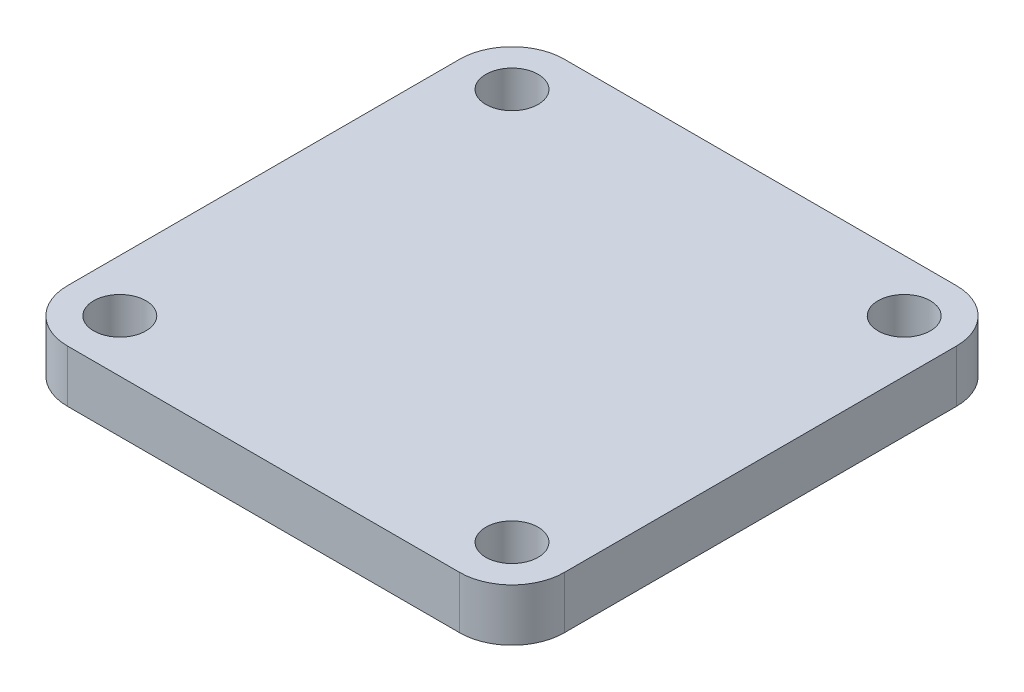
ISO-10303-21;
HEADER;
FILE_DESCRIPTION(('STEP AP214'),'2;1');
FILE_NAME('part.step','',(''),(''),'','','');
FILE_SCHEMA(('AUTOMOTIVE_DESIGN { 1 0 10303 214 1 1 1 1 }'));
ENDSEC;
DATA;
#1=APPLICATION_CONTEXT('core data for automotive mechanical design processes');
#2=APPLICATION_PROTOCOL_DEFINITION('international standard','automotive_design',2000,#1);
#3=PRODUCT_CONTEXT('',#1,'mechanical');
#4=PRODUCT('Part','Part','',(#3));
#5=PRODUCT_RELATED_PRODUCT_CATEGORY('part','',(#4));
#6=PRODUCT_DEFINITION_FORMATION('','',#4);
#7=PRODUCT_DEFINITION_CONTEXT('part definition',#1,'design');
#8=PRODUCT_DEFINITION('design','',#6,#7);
#9=PRODUCT_DEFINITION_SHAPE('','',#8);
#10=(LENGTH_UNIT() NAMED_UNIT(*) SI_UNIT(.MILLI.,.METRE.));
#11=(NAMED_UNIT(*) PLANE_ANGLE_UNIT() SI_UNIT($,.RADIAN.));
#12=(NAMED_UNIT(*) SI_UNIT($,.STERADIAN.) SOLID_ANGLE_UNIT());
#13=UNCERTAINTY_MEASURE_WITH_UNIT(LENGTH_MEASURE(1.E-05),#10,'distance_accuracy_value','');
#14=(GEOMETRIC_REPRESENTATION_CONTEXT(3) GLOBAL_UNCERTAINTY_ASSIGNED_CONTEXT((#13)) GLOBAL_UNIT_ASSIGNED_CONTEXT((#10,
#11,#12)) REPRESENTATION_CONTEXT('',''));
#15=CARTESIAN_POINT('',(0.,0.,0.));
#16=DIRECTION('',(0.,0.,1.));
#17=DIRECTION('',(1.,0.,0.));
#18=AXIS2_PLACEMENT_3D('',#15,#16,#17);
#19=CARTESIAN_POINT('',(8.58680344171121,2.,8.46010638297872));
#20=DIRECTION('',(0.,1.,0.));
#21=DIRECTION('',(0.,0.,1.));
#22=AXIS2_PLACEMENT_3D('',#19,#20,#21);
#23=PLANE('',#22);
#24=CARTESIAN_POINT('',(8.58680344171121,2.,8.46010638297872));
#25=DIRECTION('',(0.,1.,0.));
#26=DIRECTION('',(0.,0.,1.));
#27=AXIS2_PLACEMENT_3D('',#24,#25,#26);
#28=CIRCLE('',#27,1.);
#29=CARTESIAN_POINT('',(8.58680344171121,2.,9.46010638297872));
#30=VERTEX_POINT('',#29);
#31=EDGE_CURVE('E190',#30,#30,#28,.T.);
#32=ORIENTED_EDGE('',*,*,#31,.F.);
#33=EDGE_LOOP('',(#32));
#34=FACE_BOUND('',#33,.T.);
#35=CARTESIAN_POINT('',(-6.41319655828879,2.,-6.53989361702128));
#36=DIRECTION('',(0.,1.,0.));
#37=DIRECTION('',(0.,0.,1.));
#38=AXIS2_PLACEMENT_3D('',#35,#36,#37);
#39=CIRCLE('',#38,1.);
#40=CARTESIAN_POINT('',(-6.41319655828879,2.,-5.53989361702128));
#41=VERTEX_POINT('',#40);
#42=EDGE_CURVE('E136',#41,#41,#39,.T.);
#43=ORIENTED_EDGE('',*,*,#42,.F.);
#44=EDGE_LOOP('',(#43));
#45=FACE_BOUND('',#44,.T.);
#46=CARTESIAN_POINT('',(8.58680344171121,2.,8.46010638297872));
#47=DIRECTION('',(0.,1.,0.));
#48=DIRECTION('',(0.,0.,1.));
#49=AXIS2_PLACEMENT_3D('',#46,#47,#48);
#50=CIRCLE('',#49,2.);
#51=CARTESIAN_POINT('',(8.58680344171121,2.,10.4601063829787));
#52=VERTEX_POINT('',#51);
#53=CARTESIAN_POINT('',(10.5868034417112,2.,8.46010638297872));
#54=VERTEX_POINT('',#53);
#55=EDGE_CURVE('E147',#52,#54,#50,.T.);
#56=ORIENTED_EDGE('',*,*,#55,.T.);
#57=DIRECTION('',(0.,0.,-1.));
#58=VECTOR('',#57,1.);
#59=CARTESIAN_POINT('',(10.5868034417112,2.,-6.53989361702128));
#60=LINE('',#59,#58);
#61=CARTESIAN_POINT('',(10.5868034417112,2.,-6.53989361702128));
#62=VERTEX_POINT('',#61);
#63=EDGE_CURVE('E95',#54,#62,#60,.T.);
#64=ORIENTED_EDGE('',*,*,#63,.T.);
#65=CARTESIAN_POINT('',(8.58680344171121,2.,-6.53989361702128));
#66=DIRECTION('',(0.,1.,0.));
#67=DIRECTION('',(0.,0.,1.));
#68=AXIS2_PLACEMENT_3D('',#65,#66,#67);
#69=CIRCLE('',#68,2.);
#70=CARTESIAN_POINT('',(8.58680344171121,2.,-8.53989361702128));
#71=VERTEX_POINT('',#70);
#72=EDGE_CURVE('E162',#62,#71,#69,.T.);
#73=ORIENTED_EDGE('',*,*,#72,.T.);
#74=DIRECTION('',(-1.,0.,0.));
#75=VECTOR('',#74,1.);
#76=CARTESIAN_POINT('',(-6.41319655828879,2.,-8.53989361702128));
#77=LINE('',#76,#75);
#78=CARTESIAN_POINT('',(-6.41319655828879,2.,-8.53989361702128));
#79=VERTEX_POINT('',#78);
#80=EDGE_CURVE('E175',#71,#79,#77,.T.);
#81=ORIENTED_EDGE('',*,*,#80,.T.);
#82=CARTESIAN_POINT('',(-6.41319655828879,2.,-6.53989361702128));
#83=DIRECTION('',(0.,1.,0.));
#84=DIRECTION('',(0.,0.,1.));
#85=AXIS2_PLACEMENT_3D('',#82,#83,#84);
#86=CIRCLE('',#85,2.);
#87=CARTESIAN_POINT('',(-8.41319655828879,2.,-6.53989361702128));
#88=VERTEX_POINT('',#87);
#89=EDGE_CURVE('E114',#79,#88,#86,.T.);
#90=ORIENTED_EDGE('',*,*,#89,.T.);
#91=DIRECTION('',(0.,0.,1.));
#92=VECTOR('',#91,1.);
#93=CARTESIAN_POINT('',(-8.41319655828879,2.,-6.53989361702128));
#94=LINE('',#93,#92);
#95=CARTESIAN_POINT('',(-8.41319655828879,2.,8.46010638297872));
#96=VERTEX_POINT('',#95);
#97=EDGE_CURVE('E108',#88,#96,#94,.T.);
#98=ORIENTED_EDGE('',*,*,#97,.T.);
#99=CARTESIAN_POINT('',(-6.41319655828879,2.,8.46010638297872));
#100=DIRECTION('',(0.,1.,0.));
#101=DIRECTION('',(0.,0.,1.));
#102=AXIS2_PLACEMENT_3D('',#99,#100,#101);
#103=CIRCLE('',#102,2.);
#104=CARTESIAN_POINT('',(-6.41319655828879,2.,10.4601063829787));
#105=VERTEX_POINT('',#104);
#106=EDGE_CURVE('E112',#96,#105,#103,.T.);
#107=ORIENTED_EDGE('',*,*,#106,.T.);
#108=DIRECTION('',(1.,0.,0.));
#109=VECTOR('',#108,1.);
#110=CARTESIAN_POINT('',(-6.41319655828879,2.,10.4601063829787));
#111=LINE('',#110,#109);
#112=EDGE_CURVE('E52',#105,#52,#111,.T.);
#113=ORIENTED_EDGE('',*,*,#112,.T.);
#114=EDGE_LOOP('',(#56,#64,#73,#81,#90,#98,#107,#113));
#115=FACE_BOUND('',#114,.T.);
#116=CARTESIAN_POINT('',(8.58680344171121,2.,-6.53989361702128));
#117=DIRECTION('',(0.,1.,0.));
#118=DIRECTION('',(0.,0.,1.));
#119=AXIS2_PLACEMENT_3D('',#116,#117,#118);
#120=CIRCLE('',#119,1.);
#121=CARTESIAN_POINT('',(8.58680344171121,2.,-5.53989361702128));
#122=VERTEX_POINT('',#121);
#123=EDGE_CURVE('E184',#122,#122,#120,.T.);
#124=ORIENTED_EDGE('',*,*,#123,.F.);
#125=EDGE_LOOP('',(#124));
#126=FACE_BOUND('',#125,.T.);
#127=CARTESIAN_POINT('',(-6.41319655828879,2.,8.46010638297872));
#128=DIRECTION('',(0.,1.,0.));
#129=DIRECTION('',(0.,0.,1.));
#130=AXIS2_PLACEMENT_3D('',#127,#128,#129);
#131=CIRCLE('',#130,1.);
#132=CARTESIAN_POINT('',(-6.41319655828879,2.,9.46010638297872));
#133=VERTEX_POINT('',#132);
#134=EDGE_CURVE('E196',#133,#133,#131,.T.);
#135=ORIENTED_EDGE('',*,*,#134,.F.);
#136=EDGE_LOOP('',(#135));
#137=FACE_BOUND('',#136,.T.);
#138=ADVANCED_FACE('F35',(#34,#45,#115,#126,#137),#23,.T.);
#139=CARTESIAN_POINT('',(8.58680344171121,0.,8.46010638297872));
#140=DIRECTION('',(0.,1.,0.));
#141=DIRECTION('',(0.,0.,1.));
#142=AXIS2_PLACEMENT_3D('',#139,#140,#141);
#143=PLANE('',#142);
#144=CARTESIAN_POINT('',(8.58680344171121,0.,8.46010638297872));
#145=DIRECTION('',(0.,1.,0.));
#146=DIRECTION('',(0.,0.,1.));
#147=AXIS2_PLACEMENT_3D('',#144,#145,#146);
#148=CIRCLE('',#147,2.);
#149=CARTESIAN_POINT('',(8.58680344171121,0.,10.4601063829787));
#150=VERTEX_POINT('',#149);
#151=CARTESIAN_POINT('',(10.5868034417112,0.,8.46010638297872));
#152=VERTEX_POINT('',#151);
#153=EDGE_CURVE('E132',#150,#152,#148,.T.);
#154=ORIENTED_EDGE('',*,*,#153,.F.);
#155=DIRECTION('',(1.,0.,0.));
#156=VECTOR('',#155,1.);
#157=CARTESIAN_POINT('',(-6.41319655828879,0.,10.4601063829787));
#158=LINE('',#157,#156);
#159=CARTESIAN_POINT('',(-6.41319655828879,0.,10.4601063829787));
#160=VERTEX_POINT('',#159);
#161=EDGE_CURVE('E87',#160,#150,#158,.T.);
#162=ORIENTED_EDGE('',*,*,#161,.F.);
#163=CARTESIAN_POINT('',(-6.41319655828879,0.,8.46010638297872));
#164=DIRECTION('',(0.,1.,0.));
#165=DIRECTION('',(0.,0.,1.));
#166=AXIS2_PLACEMENT_3D('',#163,#164,#165);
#167=CIRCLE('',#166,2.);
#168=CARTESIAN_POINT('',(-8.41319655828879,0.,8.46010638297872));
#169=VERTEX_POINT('',#168);
#170=EDGE_CURVE('E81',#169,#160,#167,.T.);
#171=ORIENTED_EDGE('',*,*,#170,.F.);
#172=DIRECTION('',(0.,0.,1.));
#173=VECTOR('',#172,1.);
#174=CARTESIAN_POINT('',(-8.41319655828879,0.,-6.53989361702128));
#175=LINE('',#174,#173);
#176=CARTESIAN_POINT('',(-8.41319655828879,0.,-6.53989361702128));
#177=VERTEX_POINT('',#176);
#178=EDGE_CURVE('E122',#177,#169,#175,.T.);
#179=ORIENTED_EDGE('',*,*,#178,.F.);
#180=CARTESIAN_POINT('',(-6.41319655828879,0.,-6.53989361702128));
#181=DIRECTION('',(0.,1.,0.));
#182=DIRECTION('',(0.,0.,1.));
#183=AXIS2_PLACEMENT_3D('',#180,#181,#182);
#184=CIRCLE('',#183,2.);
#185=CARTESIAN_POINT('',(-6.41319655828879,0.,-8.53989361702128));
#186=VERTEX_POINT('',#185);
#187=EDGE_CURVE('E142',#186,#177,#184,.T.);
#188=ORIENTED_EDGE('',*,*,#187,.F.);
#189=DIRECTION('',(-1.,0.,0.));
#190=VECTOR('',#189,1.);
#191=CARTESIAN_POINT('',(-6.41319655828879,0.,-8.53989361702128));
#192=LINE('',#191,#190);
#193=CARTESIAN_POINT('',(8.58680344171121,0.,-8.53989361702128));
#194=VERTEX_POINT('',#193);
#195=EDGE_CURVE('E140',#194,#186,#192,.T.);
#196=ORIENTED_EDGE('',*,*,#195,.F.);
#197=CARTESIAN_POINT('',(8.58680344171121,0.,-6.53989361702128));
#198=DIRECTION('',(0.,1.,0.));
#199=DIRECTION('',(0.,0.,1.));
#200=AXIS2_PLACEMENT_3D('',#197,#198,#199);
#201=CIRCLE('',#200,2.);
#202=CARTESIAN_POINT('',(10.5868034417112,0.,-6.53989361702128));
#203=VERTEX_POINT('',#202);
#204=EDGE_CURVE('E138',#203,#194,#201,.T.);
#205=ORIENTED_EDGE('',*,*,#204,.F.);
#206=DIRECTION('',(0.,0.,-1.));
#207=VECTOR('',#206,1.);
#208=CARTESIAN_POINT('',(10.5868034417112,0.,-6.53989361702128));
#209=LINE('',#208,#207);
#210=EDGE_CURVE('E135',#152,#203,#209,.T.);
#211=ORIENTED_EDGE('',*,*,#210,.F.);
#212=EDGE_LOOP('',(#154,#162,#171,#179,#188,#196,#205,#211));
#213=FACE_BOUND('',#212,.T.);
#214=CARTESIAN_POINT('',(-6.41319655828879,0.,-6.53989361702128));
#215=DIRECTION('',(0.,1.,0.));
#216=DIRECTION('',(0.,0.,1.));
#217=AXIS2_PLACEMENT_3D('',#214,#215,#216);
#218=CIRCLE('',#217,1.);
#219=CARTESIAN_POINT('',(-6.41319655828879,0.,-5.53989361702128));
#220=VERTEX_POINT('',#219);
#221=EDGE_CURVE('E181',#220,#220,#218,.T.);
#222=ORIENTED_EDGE('',*,*,#221,.T.);
#223=EDGE_LOOP('',(#222));
#224=FACE_BOUND('',#223,.T.);
#225=CARTESIAN_POINT('',(8.58680344171121,0.,-6.53989361702128));
#226=DIRECTION('',(0.,1.,0.));
#227=DIRECTION('',(0.,0.,1.));
#228=AXIS2_PLACEMENT_3D('',#225,#226,#227);
#229=CIRCLE('',#228,1.);
#230=CARTESIAN_POINT('',(8.58680344171121,0.,-5.53989361702128));
#231=VERTEX_POINT('',#230);
#232=EDGE_CURVE('E187',#231,#231,#229,.T.);
#233=ORIENTED_EDGE('',*,*,#232,.T.);
#234=EDGE_LOOP('',(#233));
#235=FACE_BOUND('',#234,.T.);
#236=CARTESIAN_POINT('',(8.58680344171121,0.,8.46010638297872));
#237=DIRECTION('',(0.,1.,0.));
#238=DIRECTION('',(0.,0.,1.));
#239=AXIS2_PLACEMENT_3D('',#236,#237,#238);
#240=CIRCLE('',#239,1.);
#241=CARTESIAN_POINT('',(8.58680344171121,0.,9.46010638297872));
#242=VERTEX_POINT('',#241);
#243=EDGE_CURVE('E193',#242,#242,#240,.T.);
#244=ORIENTED_EDGE('',*,*,#243,.T.);
#245=EDGE_LOOP('',(#244));
#246=FACE_BOUND('',#245,.T.);
#247=CARTESIAN_POINT('',(-6.41319655828879,0.,8.46010638297872));
#248=DIRECTION('',(0.,1.,0.));
#249=DIRECTION('',(0.,0.,1.));
#250=AXIS2_PLACEMENT_3D('',#247,#248,#249);
#251=CIRCLE('',#250,1.);
#252=CARTESIAN_POINT('',(-6.41319655828879,0.,9.46010638297872));
#253=VERTEX_POINT('',#252);
#254=EDGE_CURVE('E199',#253,#253,#251,.T.);
#255=ORIENTED_EDGE('',*,*,#254,.T.);
#256=EDGE_LOOP('',(#255));
#257=FACE_BOUND('',#256,.T.);
#258=ADVANCED_FACE('F166',(#213,#224,#235,#246,#257),#143,.F.);
#259=CARTESIAN_POINT('',(8.58680344171121,2.,8.46010638297872));
#260=DIRECTION('',(0.,-1.,0.));
#261=DIRECTION('',(0.,0.,-1.));
#262=AXIS2_PLACEMENT_3D('',#259,#260,#261);
#263=CYLINDRICAL_SURFACE('',#262,2.);
#264=ORIENTED_EDGE('',*,*,#153,.T.);
#265=DIRECTION('',(0.,-1.,0.));
#266=VECTOR('',#265,1.);
#267=CARTESIAN_POINT('',(10.5868034417112,2.,8.46010638297872));
#268=LINE('',#267,#266);
#269=EDGE_CURVE('E11',#54,#152,#268,.T.);
#270=ORIENTED_EDGE('',*,*,#269,.F.);
#271=ORIENTED_EDGE('',*,*,#55,.F.);
#272=DIRECTION('',(0.,-1.,0.));
#273=VECTOR('',#272,1.);
#274=CARTESIAN_POINT('',(8.58680344171121,2.,10.4601063829787));
#275=LINE('',#274,#273);
#276=EDGE_CURVE('E128',#52,#150,#275,.T.);
#277=ORIENTED_EDGE('',*,*,#276,.T.);
#278=EDGE_LOOP('',(#264,#270,#271,#277));
#279=FACE_BOUND('',#278,.T.);
#280=ADVANCED_FACE('F37',(#279),#263,.T.);
#281=CARTESIAN_POINT('',(10.5868034417112,2.,-6.53989361702128));
#282=DIRECTION('',(-1.,0.,0.));
#283=DIRECTION('',(0.,0.,1.));
#284=AXIS2_PLACEMENT_3D('',#281,#282,#283);
#285=PLANE('',#284);
#286=ORIENTED_EDGE('',*,*,#210,.T.);
#287=DIRECTION('',(0.,-1.,0.));
#288=VECTOR('',#287,1.);
#289=CARTESIAN_POINT('',(10.5868034417112,2.,-6.53989361702128));
#290=LINE('',#289,#288);
#291=EDGE_CURVE('E44',#62,#203,#290,.T.);
#292=ORIENTED_EDGE('',*,*,#291,.F.);
#293=ORIENTED_EDGE('',*,*,#63,.F.);
#294=ORIENTED_EDGE('',*,*,#269,.T.);
#295=EDGE_LOOP('',(#286,#292,#293,#294));
#296=FACE_BOUND('',#295,.T.);
#297=ADVANCED_FACE('F233',(#296),#285,.F.);
#298=CARTESIAN_POINT('',(8.58680344171121,2.,-6.53989361702128));
#299=DIRECTION('',(0.,-1.,0.));
#300=DIRECTION('',(0.,0.,-1.));
#301=AXIS2_PLACEMENT_3D('',#298,#299,#300);
#302=CYLINDRICAL_SURFACE('',#301,2.);
#303=ORIENTED_EDGE('',*,*,#204,.T.);
#304=DIRECTION('',(0.,-1.,0.));
#305=VECTOR('',#304,1.);
#306=CARTESIAN_POINT('',(8.58680344171121,2.,-8.53989361702128));
#307=LINE('',#306,#305);
#308=EDGE_CURVE('E154',#71,#194,#307,.T.);
#309=ORIENTED_EDGE('',*,*,#308,.F.);
#310=ORIENTED_EDGE('',*,*,#72,.F.);
#311=ORIENTED_EDGE('',*,*,#291,.T.);
#312=EDGE_LOOP('',(#303,#309,#310,#311));
#313=FACE_BOUND('',#312,.T.);
#314=ADVANCED_FACE('F160',(#313),#302,.T.);
#315=CARTESIAN_POINT('',(-6.41319655828879,2.,-8.53989361702128));
#316=DIRECTION('',(0.,0.,1.));
#317=DIRECTION('',(1.,0.,0.));
#318=AXIS2_PLACEMENT_3D('',#315,#316,#317);
#319=PLANE('',#318);
#320=ORIENTED_EDGE('',*,*,#195,.T.);
#321=DIRECTION('',(0.,-1.,0.));
#322=VECTOR('',#321,1.);
#323=CARTESIAN_POINT('',(-6.41319655828879,2.,-8.53989361702128));
#324=LINE('',#323,#322);
#325=EDGE_CURVE('E151',#79,#186,#324,.T.);
#326=ORIENTED_EDGE('',*,*,#325,.F.);
#327=ORIENTED_EDGE('',*,*,#80,.F.);
#328=ORIENTED_EDGE('',*,*,#308,.T.);
#329=EDGE_LOOP('',(#320,#326,#327,#328));
#330=FACE_BOUND('',#329,.T.);
#331=ADVANCED_FACE('F171',(#330),#319,.F.);
#332=CARTESIAN_POINT('',(-6.41319655828879,2.,-6.53989361702128));
#333=DIRECTION('',(0.,-1.,0.));
#334=DIRECTION('',(0.,0.,-1.));
#335=AXIS2_PLACEMENT_3D('',#332,#333,#334);
#336=CYLINDRICAL_SURFACE('',#335,2.);
#337=ORIENTED_EDGE('',*,*,#187,.T.);
#338=DIRECTION('',(0.,-1.,0.));
#339=VECTOR('',#338,1.);
#340=CARTESIAN_POINT('',(-8.41319655828879,2.,-6.53989361702128));
#341=LINE('',#340,#339);
#342=EDGE_CURVE('E123',#88,#177,#341,.T.);
#343=ORIENTED_EDGE('',*,*,#342,.F.);
#344=ORIENTED_EDGE('',*,*,#89,.F.);
#345=ORIENTED_EDGE('',*,*,#325,.T.);
#346=EDGE_LOOP('',(#337,#343,#344,#345));
#347=FACE_BOUND('',#346,.T.);
#348=ADVANCED_FACE('F174',(#347),#336,.T.);
#349=CARTESIAN_POINT('',(-8.41319655828879,2.,-6.53989361702128));
#350=DIRECTION('',(1.,0.,0.));
#351=DIRECTION('',(0.,0.,-1.));
#352=AXIS2_PLACEMENT_3D('',#349,#350,#351);
#353=PLANE('',#352);
#354=ORIENTED_EDGE('',*,*,#178,.T.);
#355=DIRECTION('',(0.,-1.,0.));
#356=VECTOR('',#355,1.);
#357=CARTESIAN_POINT('',(-8.41319655828879,2.,8.46010638297872));
#358=LINE('',#357,#356);
#359=EDGE_CURVE('E119',#96,#169,#358,.T.);
#360=ORIENTED_EDGE('',*,*,#359,.F.);
#361=ORIENTED_EDGE('',*,*,#97,.F.);
#362=ORIENTED_EDGE('',*,*,#342,.T.);
#363=EDGE_LOOP('',(#354,#360,#361,#362));
#364=FACE_BOUND('',#363,.T.);
#365=ADVANCED_FACE('F120',(#364),#353,.F.);
#366=CARTESIAN_POINT('',(-6.41319655828879,2.,8.46010638297872));
#367=DIRECTION('',(0.,-1.,0.));
#368=DIRECTION('',(0.,0.,-1.));
#369=AXIS2_PLACEMENT_3D('',#366,#367,#368);
#370=CYLINDRICAL_SURFACE('',#369,2.);
#371=ORIENTED_EDGE('',*,*,#170,.T.);
#372=DIRECTION('',(0.,-1.,0.));
#373=VECTOR('',#372,1.);
#374=CARTESIAN_POINT('',(-6.41319655828879,2.,10.4601063829787));
#375=LINE('',#374,#373);
#376=EDGE_CURVE('E124',#105,#160,#375,.T.);
#377=ORIENTED_EDGE('',*,*,#376,.F.);
#378=ORIENTED_EDGE('',*,*,#106,.F.);
#379=ORIENTED_EDGE('',*,*,#359,.T.);
#380=EDGE_LOOP('',(#371,#377,#378,#379));
#381=FACE_BOUND('',#380,.T.);
#382=ADVANCED_FACE('F126',(#381),#370,.T.);
#383=CARTESIAN_POINT('',(-6.41319655828879,2.,10.4601063829787));
#384=DIRECTION('',(0.,0.,-1.));
#385=DIRECTION('',(-1.,0.,0.));
#386=AXIS2_PLACEMENT_3D('',#383,#384,#385);
#387=PLANE('',#386);
#388=ORIENTED_EDGE('',*,*,#161,.T.);
#389=ORIENTED_EDGE('',*,*,#276,.F.);
#390=ORIENTED_EDGE('',*,*,#112,.F.);
#391=ORIENTED_EDGE('',*,*,#376,.T.);
#392=EDGE_LOOP('',(#388,#389,#390,#391));
#393=FACE_BOUND('',#392,.T.);
#394=ADVANCED_FACE('F221',(#393),#387,.F.);
#395=CARTESIAN_POINT('',(-6.41319655828879,2.,-6.53989361702128));
#396=DIRECTION('',(0.,-1.,0.));
#397=DIRECTION('',(0.,0.,-1.));
#398=AXIS2_PLACEMENT_3D('',#395,#396,#397);
#399=CYLINDRICAL_SURFACE('',#398,1.);
#400=ORIENTED_EDGE('',*,*,#42,.T.);
#401=EDGE_LOOP('',(#400));
#402=FACE_BOUND('',#401,.T.);
#403=ORIENTED_EDGE('',*,*,#221,.F.);
#404=EDGE_LOOP('',(#403));
#405=FACE_BOUND('',#404,.T.);
#406=ADVANCED_FACE('F218',(#402,#405),#399,.F.);
#407=CARTESIAN_POINT('',(8.58680344171121,2.,-6.53989361702128));
#408=DIRECTION('',(0.,-1.,0.));
#409=DIRECTION('',(0.,0.,-1.));
#410=AXIS2_PLACEMENT_3D('',#407,#408,#409);
#411=CYLINDRICAL_SURFACE('',#410,1.);
#412=ORIENTED_EDGE('',*,*,#123,.T.);
#413=EDGE_LOOP('',(#412));
#414=FACE_BOUND('',#413,.T.);
#415=ORIENTED_EDGE('',*,*,#232,.F.);
#416=EDGE_LOOP('',(#415));
#417=FACE_BOUND('',#416,.T.);
#418=ADVANCED_FACE('F297',(#414,#417),#411,.F.);
#419=CARTESIAN_POINT('',(8.58680344171121,2.,8.46010638297872));
#420=DIRECTION('',(0.,-1.,0.));
#421=DIRECTION('',(0.,0.,-1.));
#422=AXIS2_PLACEMENT_3D('',#419,#420,#421);
#423=CYLINDRICAL_SURFACE('',#422,1.);
#424=ORIENTED_EDGE('',*,*,#31,.T.);
#425=EDGE_LOOP('',(#424));
#426=FACE_BOUND('',#425,.T.);
#427=ORIENTED_EDGE('',*,*,#243,.F.);
#428=EDGE_LOOP('',(#427));
#429=FACE_BOUND('',#428,.T.);
#430=ADVANCED_FACE('F305',(#426,#429),#423,.F.);
#431=CARTESIAN_POINT('',(-6.41319655828879,2.,8.46010638297872));
#432=DIRECTION('',(0.,-1.,0.));
#433=DIRECTION('',(0.,0.,-1.));
#434=AXIS2_PLACEMENT_3D('',#431,#432,#433);
#435=CYLINDRICAL_SURFACE('',#434,1.);
#436=ORIENTED_EDGE('',*,*,#134,.T.);
#437=EDGE_LOOP('',(#436));
#438=FACE_BOUND('',#437,.T.);
#439=ORIENTED_EDGE('',*,*,#254,.F.);
#440=EDGE_LOOP('',(#439));
#441=FACE_BOUND('',#440,.T.);
#442=ADVANCED_FACE('F205',(#438,#441),#435,.F.);
#443=CLOSED_SHELL('',(#138,#258,#280,#297,#314,#331,#348,#365,#382,#394,#406,#418,#430,#442));
#444=MANIFOLD_SOLID_BREP('B2',#443);
#445=ADVANCED_BREP_SHAPE_REPRESENTATION('',(#18,#444),#14);
#446=SHAPE_DEFINITION_REPRESENTATION(#9,#445);
ENDSEC;
END-ISO-10303-21;
